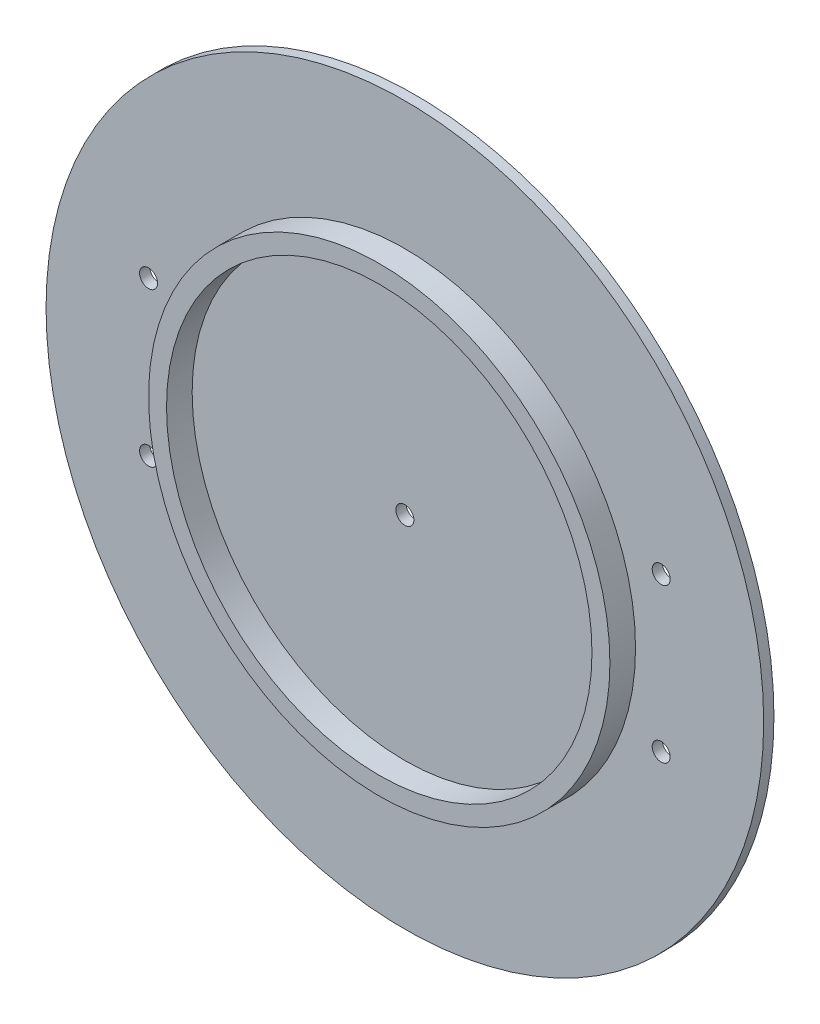
ISO-10303-21;
HEADER;
FILE_DESCRIPTION(('STEP AP214'),'2;1');
FILE_NAME('part.step','',(''),(''),'','','');
FILE_SCHEMA(('AUTOMOTIVE_DESIGN { 1 0 10303 214 1 1 1 1 }'));
ENDSEC;
DATA;
#1=APPLICATION_CONTEXT('core data for automotive mechanical design processes');
#2=APPLICATION_PROTOCOL_DEFINITION('international standard','automotive_design',2000,#1);
#3=PRODUCT_CONTEXT('',#1,'mechanical');
#4=PRODUCT('Part','Part','',(#3));
#5=PRODUCT_RELATED_PRODUCT_CATEGORY('part','',(#4));
#6=PRODUCT_DEFINITION_FORMATION('','',#4);
#7=PRODUCT_DEFINITION_CONTEXT('part definition',#1,'design');
#8=PRODUCT_DEFINITION('design','',#6,#7);
#9=PRODUCT_DEFINITION_SHAPE('','',#8);
#10=(LENGTH_UNIT() NAMED_UNIT(*) SI_UNIT(.MILLI.,.METRE.));
#11=(NAMED_UNIT(*) PLANE_ANGLE_UNIT() SI_UNIT($,.RADIAN.));
#12=(NAMED_UNIT(*) SI_UNIT($,.STERADIAN.) SOLID_ANGLE_UNIT());
#13=UNCERTAINTY_MEASURE_WITH_UNIT(LENGTH_MEASURE(1.E-05),#10,'distance_accuracy_value','');
#14=(GEOMETRIC_REPRESENTATION_CONTEXT(3) GLOBAL_UNCERTAINTY_ASSIGNED_CONTEXT((#13)) GLOBAL_UNIT_ASSIGNED_CONTEXT((#10,
#11,#12)) REPRESENTATION_CONTEXT('',''));
#15=CARTESIAN_POINT('',(0.,0.,0.));
#16=DIRECTION('',(0.,0.,1.));
#17=DIRECTION('',(1.,0.,0.));
#18=AXIS2_PLACEMENT_3D('',#15,#16,#17);
#19=CARTESIAN_POINT('',(0.,0.,2.));
#20=DIRECTION('',(0.,0.,1.));
#21=DIRECTION('',(1.,0.,0.));
#22=AXIS2_PLACEMENT_3D('',#19,#20,#21);
#23=PLANE('',#22);
#24=CARTESIAN_POINT('',(0.,0.,2.));
#25=DIRECTION('',(0.,0.,1.));
#26=DIRECTION('',(1.,0.,0.));
#27=AXIS2_PLACEMENT_3D('',#24,#25,#26);
#28=CIRCLE('',#27,1.75);
#29=CARTESIAN_POINT('',(1.74999999999999,0.,2.));
#30=VERTEX_POINT('',#29);
#31=EDGE_CURVE('E62',#30,#30,#28,.T.);
#32=ORIENTED_EDGE('',*,*,#31,.F.);
#33=EDGE_LOOP('',(#32));
#34=FACE_BOUND('',#33,.T.);
#35=CARTESIAN_POINT('',(0.,0.,2.));
#36=DIRECTION('',(0.,0.,1.));
#37=DIRECTION('',(1.,0.,0.));
#38=AXIS2_PLACEMENT_3D('',#35,#36,#37);
#39=CIRCLE('',#38,41.5);
#40=CARTESIAN_POINT('',(41.5,0.,2.));
#41=VERTEX_POINT('',#40);
#42=EDGE_CURVE('E10',#41,#41,#39,.F.);
#43=ORIENTED_EDGE('',*,*,#42,.F.);
#44=EDGE_LOOP('',(#43));
#45=FACE_BOUND('',#44,.T.);
#46=ADVANCED_FACE('F35',(#34,#45),#23,.T.);
#47=CARTESIAN_POINT('',(0.,0.,2.));
#48=DIRECTION('',(0.,0.,-1.));
#49=DIRECTION('',(-1.,0.,0.));
#50=AXIS2_PLACEMENT_3D('',#47,#48,#49);
#51=CYLINDRICAL_SURFACE('',#50,70.);
#52=CARTESIAN_POINT('',(0.,0.,2.));
#53=DIRECTION('',(0.,0.,1.));
#54=DIRECTION('',(1.,0.,0.));
#55=AXIS2_PLACEMENT_3D('',#52,#53,#54);
#56=CIRCLE('',#55,70.);
#57=CARTESIAN_POINT('',(70.,0.,2.));
#58=VERTEX_POINT('',#57);
#59=EDGE_CURVE('E42',#58,#58,#56,.T.);
#60=ORIENTED_EDGE('',*,*,#59,.F.);
#61=EDGE_LOOP('',(#60));
#62=FACE_BOUND('',#61,.T.);
#63=CARTESIAN_POINT('',(0.,0.,0.));
#64=DIRECTION('',(0.,0.,1.));
#65=DIRECTION('',(1.,0.,0.));
#66=AXIS2_PLACEMENT_3D('',#63,#64,#65);
#67=CIRCLE('',#66,70.);
#68=CARTESIAN_POINT('',(70.,0.,0.));
#69=VERTEX_POINT('',#68);
#70=EDGE_CURVE('E46',#69,#69,#67,.T.);
#71=ORIENTED_EDGE('',*,*,#70,.T.);
#72=EDGE_LOOP('',(#71));
#73=FACE_BOUND('',#72,.T.);
#74=ADVANCED_FACE('F37',(#62,#73),#51,.T.);
#75=CARTESIAN_POINT('',(0.,0.,2.));
#76=DIRECTION('',(0.,0.,1.));
#77=DIRECTION('',(1.,0.,0.));
#78=AXIS2_PLACEMENT_3D('',#75,#76,#77);
#79=CIRCLE('',#78,45.);
#80=CARTESIAN_POINT('',(45.,0.,2.));
#81=VERTEX_POINT('',#80);
#82=EDGE_CURVE('E83',#81,#81,#79,.T.);
#83=ORIENTED_EDGE('',*,*,#82,.F.);
#84=EDGE_LOOP('',(#83));
#85=FACE_BOUND('',#84,.T.);
#86=CARTESIAN_POINT('',(-50.,-15.,2.));
#87=DIRECTION('',(0.,0.,1.));
#88=DIRECTION('',(1.,0.,0.));
#89=AXIS2_PLACEMENT_3D('',#86,#87,#88);
#90=CIRCLE('',#89,1.75);
#91=CARTESIAN_POINT('',(-48.25,-15.,2.));
#92=VERTEX_POINT('',#91);
#93=EDGE_CURVE('E69',#92,#92,#90,.T.);
#94=ORIENTED_EDGE('',*,*,#93,.F.);
#95=EDGE_LOOP('',(#94));
#96=FACE_BOUND('',#95,.T.);
#97=CARTESIAN_POINT('',(50.,-15.,2.));
#98=DIRECTION('',(0.,0.,1.));
#99=DIRECTION('',(1.,0.,0.));
#100=AXIS2_PLACEMENT_3D('',#97,#98,#99);
#101=CIRCLE('',#100,1.75);
#102=CARTESIAN_POINT('',(51.75,-15.,2.));
#103=VERTEX_POINT('',#102);
#104=EDGE_CURVE('E75',#103,#103,#101,.T.);
#105=ORIENTED_EDGE('',*,*,#104,.F.);
#106=EDGE_LOOP('',(#105));
#107=FACE_BOUND('',#106,.T.);
#108=CARTESIAN_POINT('',(50.,15.,2.));
#109=DIRECTION('',(0.,0.,1.));
#110=DIRECTION('',(1.,0.,0.));
#111=AXIS2_PLACEMENT_3D('',#108,#109,#110);
#112=CIRCLE('',#111,1.75);
#113=CARTESIAN_POINT('',(51.75,15.,2.));
#114=VERTEX_POINT('',#113);
#115=EDGE_CURVE('E56',#114,#114,#112,.T.);
#116=ORIENTED_EDGE('',*,*,#115,.F.);
#117=EDGE_LOOP('',(#116));
#118=FACE_BOUND('',#117,.T.);
#119=CARTESIAN_POINT('',(-50.,15.,2.));
#120=DIRECTION('',(0.,0.,1.));
#121=DIRECTION('',(1.,0.,0.));
#122=AXIS2_PLACEMENT_3D('',#119,#120,#121);
#123=CIRCLE('',#122,1.75);
#124=CARTESIAN_POINT('',(-48.25,15.,2.));
#125=VERTEX_POINT('',#124);
#126=EDGE_CURVE('E53',#125,#125,#123,.T.);
#127=ORIENTED_EDGE('',*,*,#126,.F.);
#128=EDGE_LOOP('',(#127));
#129=FACE_BOUND('',#128,.T.);
#130=ORIENTED_EDGE('',*,*,#59,.T.);
#131=EDGE_LOOP('',(#130));
#132=FACE_BOUND('',#131,.T.);
#133=ADVANCED_FACE('F113',(#85,#96,#107,#118,#129,#132),#23,.T.);
#134=CARTESIAN_POINT('',(0.,0.,0.));
#135=DIRECTION('',(0.,0.,1.));
#136=DIRECTION('',(1.,0.,0.));
#137=AXIS2_PLACEMENT_3D('',#134,#135,#136);
#138=PLANE('',#137);
#139=CARTESIAN_POINT('',(0.,0.,0.));
#140=DIRECTION('',(0.,0.,1.));
#141=DIRECTION('',(1.,0.,0.));
#142=AXIS2_PLACEMENT_3D('',#139,#140,#141);
#143=CIRCLE('',#142,1.75);
#144=CARTESIAN_POINT('',(1.74999999999999,0.,0.));
#145=VERTEX_POINT('',#144);
#146=EDGE_CURVE('E59',#145,#145,#143,.T.);
#147=ORIENTED_EDGE('',*,*,#146,.T.);
#148=EDGE_LOOP('',(#147));
#149=FACE_BOUND('',#148,.T.);
#150=CARTESIAN_POINT('',(-50.,-15.,0.));
#151=DIRECTION('',(0.,0.,1.));
#152=DIRECTION('',(1.,0.,0.));
#153=AXIS2_PLACEMENT_3D('',#150,#151,#152);
#154=CIRCLE('',#153,1.75);
#155=CARTESIAN_POINT('',(-48.25,-15.,0.));
#156=VERTEX_POINT('',#155);
#157=EDGE_CURVE('E66',#156,#156,#154,.T.);
#158=ORIENTED_EDGE('',*,*,#157,.T.);
#159=EDGE_LOOP('',(#158));
#160=FACE_BOUND('',#159,.T.);
#161=CARTESIAN_POINT('',(50.,-15.,0.));
#162=DIRECTION('',(0.,0.,1.));
#163=DIRECTION('',(1.,0.,0.));
#164=AXIS2_PLACEMENT_3D('',#161,#162,#163);
#165=CIRCLE('',#164,1.75);
#166=CARTESIAN_POINT('',(51.75,-15.,0.));
#167=VERTEX_POINT('',#166);
#168=EDGE_CURVE('E72',#167,#167,#165,.T.);
#169=ORIENTED_EDGE('',*,*,#168,.T.);
#170=EDGE_LOOP('',(#169));
#171=FACE_BOUND('',#170,.T.);
#172=CARTESIAN_POINT('',(50.,15.,0.));
#173=DIRECTION('',(0.,0.,1.));
#174=DIRECTION('',(1.,0.,0.));
#175=AXIS2_PLACEMENT_3D('',#172,#173,#174);
#176=CIRCLE('',#175,1.75);
#177=CARTESIAN_POINT('',(51.75,15.,0.));
#178=VERTEX_POINT('',#177);
#179=EDGE_CURVE('E78',#178,#178,#176,.T.);
#180=ORIENTED_EDGE('',*,*,#179,.T.);
#181=EDGE_LOOP('',(#180));
#182=FACE_BOUND('',#181,.T.);
#183=CARTESIAN_POINT('',(-50.,15.,0.));
#184=DIRECTION('',(0.,0.,1.));
#185=DIRECTION('',(1.,0.,0.));
#186=AXIS2_PLACEMENT_3D('',#183,#184,#185);
#187=CIRCLE('',#186,1.75);
#188=CARTESIAN_POINT('',(-48.25,15.,0.));
#189=VERTEX_POINT('',#188);
#190=EDGE_CURVE('E51',#189,#189,#187,.T.);
#191=ORIENTED_EDGE('',*,*,#190,.T.);
#192=EDGE_LOOP('',(#191));
#193=FACE_BOUND('',#192,.T.);
#194=ORIENTED_EDGE('',*,*,#70,.F.);
#195=EDGE_LOOP('',(#194));
#196=FACE_BOUND('',#195,.T.);
#197=ADVANCED_FACE('F122',(#149,#160,#171,#182,#193,#196),#138,.F.);
#198=CARTESIAN_POINT('',(-50.,15.,0.));
#199=DIRECTION('',(0.,0.,1.));
#200=DIRECTION('',(1.,0.,0.));
#201=AXIS2_PLACEMENT_3D('',#198,#199,#200);
#202=CYLINDRICAL_SURFACE('',#201,1.75);
#203=ORIENTED_EDGE('',*,*,#190,.F.);
#204=EDGE_LOOP('',(#203));
#205=FACE_BOUND('',#204,.T.);
#206=ORIENTED_EDGE('',*,*,#126,.T.);
#207=EDGE_LOOP('',(#206));
#208=FACE_BOUND('',#207,.T.);
#209=ADVANCED_FACE('F127',(#205,#208),#202,.F.);
#210=CARTESIAN_POINT('',(50.,15.,0.));
#211=DIRECTION('',(0.,0.,1.));
#212=DIRECTION('',(1.,0.,0.));
#213=AXIS2_PLACEMENT_3D('',#210,#211,#212);
#214=CYLINDRICAL_SURFACE('',#213,1.75);
#215=ORIENTED_EDGE('',*,*,#179,.F.);
#216=EDGE_LOOP('',(#215));
#217=FACE_BOUND('',#216,.T.);
#218=ORIENTED_EDGE('',*,*,#115,.T.);
#219=EDGE_LOOP('',(#218));
#220=FACE_BOUND('',#219,.T.);
#221=ADVANCED_FACE('F140',(#217,#220),#214,.F.);
#222=CARTESIAN_POINT('',(50.,-15.,0.));
#223=DIRECTION('',(0.,0.,1.));
#224=DIRECTION('',(1.,0.,0.));
#225=AXIS2_PLACEMENT_3D('',#222,#223,#224);
#226=CYLINDRICAL_SURFACE('',#225,1.75);
#227=ORIENTED_EDGE('',*,*,#168,.F.);
#228=EDGE_LOOP('',(#227));
#229=FACE_BOUND('',#228,.T.);
#230=ORIENTED_EDGE('',*,*,#104,.T.);
#231=EDGE_LOOP('',(#230));
#232=FACE_BOUND('',#231,.T.);
#233=ADVANCED_FACE('F145',(#229,#232),#226,.F.);
#234=CARTESIAN_POINT('',(-50.,-15.,0.));
#235=DIRECTION('',(0.,0.,1.));
#236=DIRECTION('',(1.,0.,0.));
#237=AXIS2_PLACEMENT_3D('',#234,#235,#236);
#238=CYLINDRICAL_SURFACE('',#237,1.75);
#239=ORIENTED_EDGE('',*,*,#157,.F.);
#240=EDGE_LOOP('',(#239));
#241=FACE_BOUND('',#240,.T.);
#242=ORIENTED_EDGE('',*,*,#93,.T.);
#243=EDGE_LOOP('',(#242));
#244=FACE_BOUND('',#243,.T.);
#245=ADVANCED_FACE('F106',(#241,#244),#238,.F.);
#246=CARTESIAN_POINT('',(0.,0.,0.));
#247=DIRECTION('',(0.,0.,1.));
#248=DIRECTION('',(1.,0.,0.));
#249=AXIS2_PLACEMENT_3D('',#246,#247,#248);
#250=CYLINDRICAL_SURFACE('',#249,1.75);
#251=ORIENTED_EDGE('',*,*,#146,.F.);
#252=EDGE_LOOP('',(#251));
#253=FACE_BOUND('',#252,.T.);
#254=ORIENTED_EDGE('',*,*,#31,.T.);
#255=EDGE_LOOP('',(#254));
#256=FACE_BOUND('',#255,.T.);
#257=ADVANCED_FACE('F97',(#253,#256),#250,.F.);
#258=CARTESIAN_POINT('',(0.,0.,7.));
#259=DIRECTION('',(0.,0.,1.));
#260=DIRECTION('',(1.,0.,0.));
#261=AXIS2_PLACEMENT_3D('',#258,#259,#260);
#262=PLANE('',#261);
#263=CARTESIAN_POINT('',(0.,0.,7.));
#264=DIRECTION('',(0.,0.,1.));
#265=DIRECTION('',(1.,0.,0.));
#266=AXIS2_PLACEMENT_3D('',#263,#264,#265);
#267=CIRCLE('',#266,45.);
#268=CARTESIAN_POINT('',(45.,0.,7.));
#269=VERTEX_POINT('',#268);
#270=EDGE_CURVE('E63',#269,#269,#267,.T.);
#271=ORIENTED_EDGE('',*,*,#270,.T.);
#272=EDGE_LOOP('',(#271));
#273=FACE_BOUND('',#272,.T.);
#274=CARTESIAN_POINT('',(0.,0.,7.));
#275=DIRECTION('',(0.,0.,1.));
#276=DIRECTION('',(1.,0.,0.));
#277=AXIS2_PLACEMENT_3D('',#274,#275,#276);
#278=CIRCLE('',#277,41.5);
#279=CARTESIAN_POINT('',(41.5,0.,7.));
#280=VERTEX_POINT('',#279);
#281=EDGE_CURVE('E86',#280,#280,#278,.T.);
#282=ORIENTED_EDGE('',*,*,#281,.F.);
#283=EDGE_LOOP('',(#282));
#284=FACE_BOUND('',#283,.T.);
#285=ADVANCED_FACE('F94',(#273,#284),#262,.T.);
#286=CARTESIAN_POINT('',(0.,0.,7.));
#287=DIRECTION('',(0.,0.,-1.));
#288=DIRECTION('',(-1.,0.,0.));
#289=AXIS2_PLACEMENT_3D('',#286,#287,#288);
#290=CYLINDRICAL_SURFACE('',#289,45.);
#291=ORIENTED_EDGE('',*,*,#270,.F.);
#292=EDGE_LOOP('',(#291));
#293=FACE_BOUND('',#292,.T.);
#294=ORIENTED_EDGE('',*,*,#82,.T.);
#295=EDGE_LOOP('',(#294));
#296=FACE_BOUND('',#295,.T.);
#297=ADVANCED_FACE('F96',(#293,#296),#290,.T.);
#298=CARTESIAN_POINT('',(0.,0.,7.));
#299=DIRECTION('',(0.,0.,-1.));
#300=DIRECTION('',(-1.,0.,0.));
#301=AXIS2_PLACEMENT_3D('',#298,#299,#300);
#302=CYLINDRICAL_SURFACE('',#301,41.5);
#303=ORIENTED_EDGE('',*,*,#281,.T.);
#304=EDGE_LOOP('',(#303));
#305=FACE_BOUND('',#304,.T.);
#306=ORIENTED_EDGE('',*,*,#42,.T.);
#307=EDGE_LOOP('',(#306));
#308=FACE_BOUND('',#307,.T.);
#309=ADVANCED_FACE('F92',(#305,#308),#302,.F.);
#310=CLOSED_SHELL('',(#46,#74,#133,#197,#209,#221,#233,#245,#257,#285,#297,#309));
#311=MANIFOLD_SOLID_BREP('B2',#310);
#312=ADVANCED_BREP_SHAPE_REPRESENTATION('',(#18,#311),#14);
#313=SHAPE_DEFINITION_REPRESENTATION(#9,#312);
ENDSEC;
END-ISO-10303-21;
